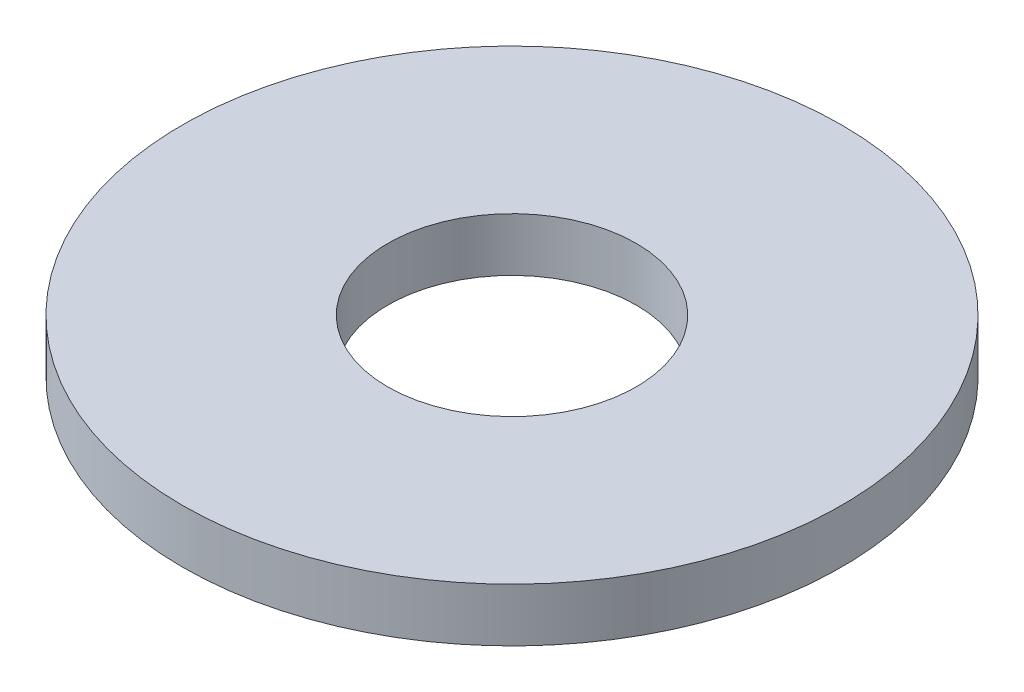
ISO-10303-21;
HEADER;
FILE_DESCRIPTION(('STEP AP214'),'2;1');
FILE_NAME('part.step','',(''),(''),'','','');
FILE_SCHEMA(('AUTOMOTIVE_DESIGN { 1 0 10303 214 1 1 1 1 }'));
ENDSEC;
DATA;
#1=APPLICATION_CONTEXT('core data for automotive mechanical design processes');
#2=APPLICATION_PROTOCOL_DEFINITION('international standard','automotive_design',2000,#1);
#3=PRODUCT_CONTEXT('',#1,'mechanical');
#4=PRODUCT('Part','Part','',(#3));
#5=PRODUCT_RELATED_PRODUCT_CATEGORY('part','',(#4));
#6=PRODUCT_DEFINITION_FORMATION('','',#4);
#7=PRODUCT_DEFINITION_CONTEXT('part definition',#1,'design');
#8=PRODUCT_DEFINITION('design','',#6,#7);
#9=PRODUCT_DEFINITION_SHAPE('','',#8);
#10=(LENGTH_UNIT() NAMED_UNIT(*) SI_UNIT(.MILLI.,.METRE.));
#11=(NAMED_UNIT(*) PLANE_ANGLE_UNIT() SI_UNIT($,.RADIAN.));
#12=(NAMED_UNIT(*) SI_UNIT($,.STERADIAN.) SOLID_ANGLE_UNIT());
#13=UNCERTAINTY_MEASURE_WITH_UNIT(LENGTH_MEASURE(1.E-05),#10,'distance_accuracy_value','');
#14=(GEOMETRIC_REPRESENTATION_CONTEXT(3) GLOBAL_UNCERTAINTY_ASSIGNED_CONTEXT((#13)) GLOBAL_UNIT_ASSIGNED_CONTEXT((#10,
#11,#12)) REPRESENTATION_CONTEXT('',''));
#15=CARTESIAN_POINT('',(0.,0.,0.));
#16=DIRECTION('',(0.,0.,1.));
#17=DIRECTION('',(1.,0.,0.));
#18=AXIS2_PLACEMENT_3D('',#15,#16,#17);
#19=CARTESIAN_POINT('',(0.,1.8034,0.));
#20=DIRECTION('',(0.,1.,0.));
#21=DIRECTION('',(0.,0.,1.));
#22=AXIS2_PLACEMENT_3D('',#19,#20,#21);
#23=PLANE('',#22);
#24=CARTESIAN_POINT('',(0.,1.8034,0.));
#25=DIRECTION('',(0.,1.,0.));
#26=DIRECTION('',(0.,0.,1.));
#27=AXIS2_PLACEMENT_3D('',#24,#25,#26);
#28=CIRCLE('',#27,11.1125);
#29=CARTESIAN_POINT('',(0.,1.8034,11.1125));
#30=VERTEX_POINT('',#29);
#31=EDGE_CURVE('E10',#30,#30,#28,.T.);
#32=ORIENTED_EDGE('',*,*,#31,.T.);
#33=EDGE_LOOP('',(#32));
#34=FACE_BOUND('',#33,.T.);
#35=CARTESIAN_POINT('',(0.,1.8034,0.));
#36=DIRECTION('',(0.,1.,0.));
#37=DIRECTION('',(0.,0.,1.));
#38=AXIS2_PLACEMENT_3D('',#35,#36,#37);
#39=CIRCLE('',#38,4.191);
#40=CARTESIAN_POINT('',(0.,1.8034,4.191));
#41=VERTEX_POINT('',#40);
#42=EDGE_CURVE('E42',#41,#41,#39,.T.);
#43=ORIENTED_EDGE('',*,*,#42,.F.);
#44=EDGE_LOOP('',(#43));
#45=FACE_BOUND('',#44,.T.);
#46=ADVANCED_FACE('F31',(#34,#45),#23,.T.);
#47=CARTESIAN_POINT('',(0.,0.,0.));
#48=DIRECTION('',(0.,1.,0.));
#49=DIRECTION('',(0.,0.,1.));
#50=AXIS2_PLACEMENT_3D('',#47,#48,#49);
#51=PLANE('',#50);
#52=CARTESIAN_POINT('',(0.,0.,0.));
#53=DIRECTION('',(0.,1.,0.));
#54=DIRECTION('',(0.,0.,1.));
#55=AXIS2_PLACEMENT_3D('',#52,#53,#54);
#56=CIRCLE('',#55,11.1125);
#57=CARTESIAN_POINT('',(0.,0.,11.1125));
#58=VERTEX_POINT('',#57);
#59=EDGE_CURVE('E35',#58,#58,#56,.T.);
#60=ORIENTED_EDGE('',*,*,#59,.F.);
#61=EDGE_LOOP('',(#60));
#62=FACE_BOUND('',#61,.T.);
#63=CARTESIAN_POINT('',(0.,0.,0.));
#64=DIRECTION('',(0.,1.,0.));
#65=DIRECTION('',(0.,0.,1.));
#66=AXIS2_PLACEMENT_3D('',#63,#64,#65);
#67=CIRCLE('',#66,4.191);
#68=CARTESIAN_POINT('',(0.,0.,4.191));
#69=VERTEX_POINT('',#68);
#70=EDGE_CURVE('E44',#69,#69,#67,.T.);
#71=ORIENTED_EDGE('',*,*,#70,.T.);
#72=EDGE_LOOP('',(#71));
#73=FACE_BOUND('',#72,.T.);
#74=ADVANCED_FACE('F54',(#62,#73),#51,.F.);
#75=CARTESIAN_POINT('',(0.,1.8034,0.));
#76=DIRECTION('',(0.,-1.,0.));
#77=DIRECTION('',(0.,0.,-1.));
#78=AXIS2_PLACEMENT_3D('',#75,#76,#77);
#79=CYLINDRICAL_SURFACE('',#78,11.1125);
#80=ORIENTED_EDGE('',*,*,#31,.F.);
#81=EDGE_LOOP('',(#80));
#82=FACE_BOUND('',#81,.T.);
#83=ORIENTED_EDGE('',*,*,#59,.T.);
#84=EDGE_LOOP('',(#83));
#85=FACE_BOUND('',#84,.T.);
#86=ADVANCED_FACE('F33',(#82,#85),#79,.T.);
#87=CARTESIAN_POINT('',(0.,1.8034,0.));
#88=DIRECTION('',(0.,-1.,0.));
#89=DIRECTION('',(0.,0.,-1.));
#90=AXIS2_PLACEMENT_3D('',#87,#88,#89);
#91=CYLINDRICAL_SURFACE('',#90,4.191);
#92=ORIENTED_EDGE('',*,*,#42,.T.);
#93=EDGE_LOOP('',(#92));
#94=FACE_BOUND('',#93,.T.);
#95=ORIENTED_EDGE('',*,*,#70,.F.);
#96=EDGE_LOOP('',(#95));
#97=FACE_BOUND('',#96,.T.);
#98=ADVANCED_FACE('F50',(#94,#97),#91,.F.);
#99=CLOSED_SHELL('',(#46,#74,#86,#98));
#100=MANIFOLD_SOLID_BREP('B2',#99);
#101=ADVANCED_BREP_SHAPE_REPRESENTATION('',(#18,#100),#14);
#102=SHAPE_DEFINITION_REPRESENTATION(#9,#101);
ENDSEC;
END-ISO-10303-21;
